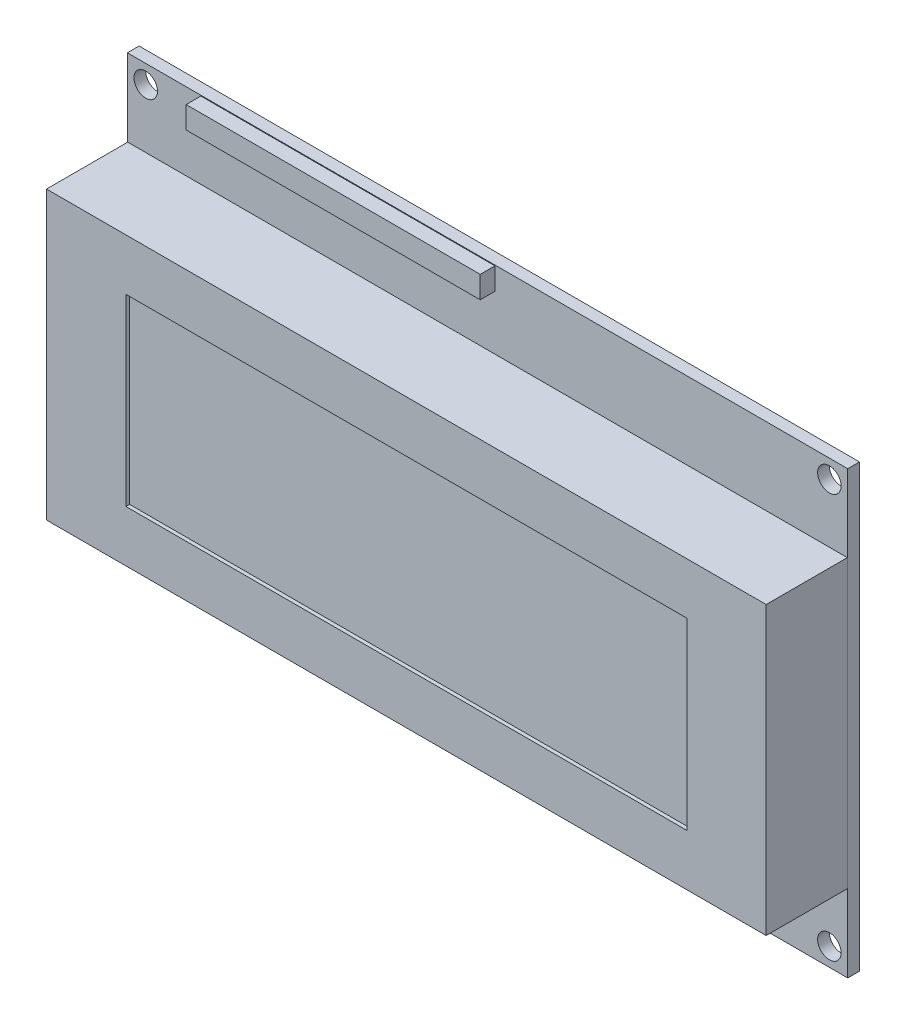
ISO-10303-21;
HEADER;
FILE_DESCRIPTION(('STEP AP214'),'2;1');
FILE_NAME('part.step','',(''),(''),'','','');
FILE_SCHEMA(('AUTOMOTIVE_DESIGN { 1 0 10303 214 1 1 1 1 }'));
ENDSEC;
DATA;
#1=APPLICATION_CONTEXT('core data for automotive mechanical design processes');
#2=APPLICATION_PROTOCOL_DEFINITION('international standard','automotive_design',2000,#1);
#3=PRODUCT_CONTEXT('',#1,'mechanical');
#4=PRODUCT('Part','Part','',(#3));
#5=PRODUCT_RELATED_PRODUCT_CATEGORY('part','',(#4));
#6=PRODUCT_DEFINITION_FORMATION('','',#4);
#7=PRODUCT_DEFINITION_CONTEXT('part definition',#1,'design');
#8=PRODUCT_DEFINITION('design','',#6,#7);
#9=PRODUCT_DEFINITION_SHAPE('','',#8);
#10=(LENGTH_UNIT() NAMED_UNIT(*) SI_UNIT(.MILLI.,.METRE.));
#11=(NAMED_UNIT(*) PLANE_ANGLE_UNIT() SI_UNIT($,.RADIAN.));
#12=(NAMED_UNIT(*) SI_UNIT($,.STERADIAN.) SOLID_ANGLE_UNIT());
#13=UNCERTAINTY_MEASURE_WITH_UNIT(LENGTH_MEASURE(1.E-05),#10,'distance_accuracy_value','');
#14=(GEOMETRIC_REPRESENTATION_CONTEXT(3) GLOBAL_UNCERTAINTY_ASSIGNED_CONTEXT((#13)) GLOBAL_UNIT_ASSIGNED_CONTEXT((#10,
#11,#12)) REPRESENTATION_CONTEXT('',''));
#15=CARTESIAN_POINT('',(0.,0.,0.));
#16=DIRECTION('',(0.,0.,1.));
#17=DIRECTION('',(1.,0.,0.));
#18=AXIS2_PLACEMENT_3D('',#15,#16,#17);
#19=CARTESIAN_POINT('',(0.,0.,1.6));
#20=DIRECTION('',(0.,0.,1.));
#21=DIRECTION('',(1.,0.,0.));
#22=AXIS2_PLACEMENT_3D('',#19,#20,#21);
#23=PLANE('',#22);
#24=CARTESIAN_POINT('',(46.5,27.5,1.6));
#25=DIRECTION('',(0.,0.,1.));
#26=DIRECTION('',(1.,0.,0.));
#27=AXIS2_PLACEMENT_3D('',#24,#25,#26);
#28=CIRCLE('',#27,1.6);
#29=CARTESIAN_POINT('',(48.1,27.5,1.6));
#30=VERTEX_POINT('',#29);
#31=EDGE_CURVE('E236',#30,#30,#28,.T.);
#32=ORIENTED_EDGE('',*,*,#31,.F.);
#33=EDGE_LOOP('',(#32));
#34=FACE_BOUND('',#33,.T.);
#35=CARTESIAN_POINT('',(46.5,-27.5,1.6));
#36=DIRECTION('',(0.,0.,1.));
#37=DIRECTION('',(1.,0.,0.));
#38=AXIS2_PLACEMENT_3D('',#35,#36,#37);
#39=CIRCLE('',#38,1.6);
#40=CARTESIAN_POINT('',(48.1,-27.5,1.6));
#41=VERTEX_POINT('',#40);
#42=EDGE_CURVE('E240',#41,#41,#39,.T.);
#43=ORIENTED_EDGE('',*,*,#42,.F.);
#44=EDGE_LOOP('',(#43));
#45=FACE_BOUND('',#44,.T.);
#46=CARTESIAN_POINT('',(-46.5,-27.5,1.6));
#47=DIRECTION('',(0.,0.,1.));
#48=DIRECTION('',(1.,0.,0.));
#49=AXIS2_PLACEMENT_3D('',#46,#47,#48);
#50=CIRCLE('',#49,1.6);
#51=CARTESIAN_POINT('',(-44.9,-27.5,1.6));
#52=VERTEX_POINT('',#51);
#53=EDGE_CURVE('E246',#52,#52,#50,.T.);
#54=ORIENTED_EDGE('',*,*,#53,.F.);
#55=EDGE_LOOP('',(#54));
#56=FACE_BOUND('',#55,.T.);
#57=CARTESIAN_POINT('',(-46.5,27.5,1.6));
#58=DIRECTION('',(0.,0.,1.));
#59=DIRECTION('',(1.,0.,0.));
#60=AXIS2_PLACEMENT_3D('',#57,#58,#59);
#61=CIRCLE('',#60,1.6);
#62=CARTESIAN_POINT('',(-44.9,27.5,1.6));
#63=VERTEX_POINT('',#62);
#64=EDGE_CURVE('E252',#63,#63,#61,.T.);
#65=ORIENTED_EDGE('',*,*,#64,.F.);
#66=EDGE_LOOP('',(#65));
#67=FACE_BOUND('',#66,.T.);
#68=DIRECTION('',(0.,1.,0.));
#69=VECTOR('',#68,1.);
#70=CARTESIAN_POINT('',(49.,30.,1.6));
#71=LINE('',#70,#69);
#72=CARTESIAN_POINT('',(49.,-30.,1.6));
#73=VERTEX_POINT('',#72);
#74=CARTESIAN_POINT('',(49.,30.,1.6));
#75=VERTEX_POINT('',#74);
#76=EDGE_CURVE('E261',#73,#75,#71,.T.);
#77=ORIENTED_EDGE('',*,*,#76,.T.);
#78=DIRECTION('',(-1.,0.,0.));
#79=VECTOR('',#78,1.);
#80=CARTESIAN_POINT('',(-49.,30.,1.6));
#81=LINE('',#80,#79);
#82=CARTESIAN_POINT('',(-49.,30.,1.6));
#83=VERTEX_POINT('',#82);
#84=EDGE_CURVE('E264',#75,#83,#81,.T.);
#85=ORIENTED_EDGE('',*,*,#84,.T.);
#86=DIRECTION('',(0.,-1.,0.));
#87=VECTOR('',#86,1.);
#88=CARTESIAN_POINT('',(-49.,30.,1.6));
#89=LINE('',#88,#87);
#90=CARTESIAN_POINT('',(-49.,-30.,1.6));
#91=VERTEX_POINT('',#90);
#92=EDGE_CURVE('E267',#83,#91,#89,.T.);
#93=ORIENTED_EDGE('',*,*,#92,.T.);
#94=DIRECTION('',(1.,0.,0.));
#95=VECTOR('',#94,1.);
#96=CARTESIAN_POINT('',(-49.,-30.,1.6));
#97=LINE('',#96,#95);
#98=EDGE_CURVE('E269',#91,#73,#97,.T.);
#99=ORIENTED_EDGE('',*,*,#98,.T.);
#100=EDGE_LOOP('',(#77,#85,#93,#99));
#101=FACE_BOUND('',#100,.T.);
#102=DIRECTION('',(-1.,0.,0.));
#103=VECTOR('',#102,1.);
#104=CARTESIAN_POINT('',(-48.95,19.5,1.6));
#105=LINE('',#104,#103);
#106=CARTESIAN_POINT('',(48.95,19.5,1.6));
#107=VERTEX_POINT('',#106);
#108=CARTESIAN_POINT('',(-48.95,19.5,1.6));
#109=VERTEX_POINT('',#108);
#110=EDGE_CURVE('E221',#107,#109,#105,.T.);
#111=ORIENTED_EDGE('',*,*,#110,.F.);
#112=DIRECTION('',(0.,1.,0.));
#113=VECTOR('',#112,1.);
#114=CARTESIAN_POINT('',(48.95,19.5,1.6));
#115=LINE('',#114,#113);
#116=CARTESIAN_POINT('',(48.95,-19.5,1.6));
#117=VERTEX_POINT('',#116);
#118=EDGE_CURVE('E202',#117,#107,#115,.T.);
#119=ORIENTED_EDGE('',*,*,#118,.F.);
#120=DIRECTION('',(1.,0.,0.));
#121=VECTOR('',#120,1.);
#122=CARTESIAN_POINT('',(-48.95,-19.5,1.6));
#123=LINE('',#122,#121);
#124=CARTESIAN_POINT('',(-48.95,-19.5,1.6));
#125=VERTEX_POINT('',#124);
#126=EDGE_CURVE('E212',#125,#117,#123,.T.);
#127=ORIENTED_EDGE('',*,*,#126,.F.);
#128=DIRECTION('',(0.,-1.,0.));
#129=VECTOR('',#128,1.);
#130=CARTESIAN_POINT('',(-48.95,19.5,1.6));
#131=LINE('',#130,#129);
#132=EDGE_CURVE('E223',#109,#125,#131,.T.);
#133=ORIENTED_EDGE('',*,*,#132,.F.);
#134=EDGE_LOOP('',(#111,#119,#127,#133));
#135=FACE_BOUND('',#134,.T.);
#136=DIRECTION('',(1.,0.,0.));
#137=VECTOR('',#136,1.);
#138=CARTESIAN_POINT('',(-39.,26.9,1.6));
#139=LINE('',#138,#137);
#140=CARTESIAN_POINT('',(-39.,26.9,1.6));
#141=VERTEX_POINT('',#140);
#142=CARTESIAN_POINT('',(1.,26.9,1.6));
#143=VERTEX_POINT('',#142);
#144=EDGE_CURVE('E544',#141,#143,#139,.T.);
#145=ORIENTED_EDGE('',*,*,#144,.F.);
#146=DIRECTION('',(0.,-1.,0.));
#147=VECTOR('',#146,1.);
#148=CARTESIAN_POINT('',(-39.,29.9,1.6));
#149=LINE('',#148,#147);
#150=CARTESIAN_POINT('',(-39.,29.9,1.6));
#151=VERTEX_POINT('',#150);
#152=EDGE_CURVE('E171',#151,#141,#149,.T.);
#153=ORIENTED_EDGE('',*,*,#152,.F.);
#154=DIRECTION('',(-1.,0.,0.));
#155=VECTOR('',#154,1.);
#156=CARTESIAN_POINT('',(-39.,29.9,1.6));
#157=LINE('',#156,#155);
#158=CARTESIAN_POINT('',(1.,29.9,1.6));
#159=VERTEX_POINT('',#158);
#160=EDGE_CURVE('E167',#159,#151,#157,.T.);
#161=ORIENTED_EDGE('',*,*,#160,.F.);
#162=DIRECTION('',(0.,1.,0.));
#163=VECTOR('',#162,1.);
#164=CARTESIAN_POINT('',(1.,29.9,1.6));
#165=LINE('',#164,#163);
#166=EDGE_CURVE('E541',#143,#159,#165,.T.);
#167=ORIENTED_EDGE('',*,*,#166,.F.);
#168=EDGE_LOOP('',(#145,#153,#161,#167));
#169=FACE_BOUND('',#168,.T.);
#170=ADVANCED_FACE('F35',(#34,#45,#56,#67,#101,#135,#169),#23,.T.);
#171=CARTESIAN_POINT('',(49.,30.,1.6));
#172=DIRECTION('',(-1.,0.,0.));
#173=DIRECTION('',(0.,0.,1.));
#174=AXIS2_PLACEMENT_3D('',#171,#172,#173);
#175=PLANE('',#174);
#176=DIRECTION('',(0.,1.,0.));
#177=VECTOR('',#176,1.);
#178=CARTESIAN_POINT('',(49.,30.,0.));
#179=LINE('',#178,#177);
#180=CARTESIAN_POINT('',(49.,-30.,0.));
#181=VERTEX_POINT('',#180);
#182=CARTESIAN_POINT('',(49.,30.,0.));
#183=VERTEX_POINT('',#182);
#184=EDGE_CURVE('E258',#181,#183,#179,.T.);
#185=ORIENTED_EDGE('',*,*,#184,.T.);
#186=DIRECTION('',(0.,0.,-1.));
#187=VECTOR('',#186,1.);
#188=CARTESIAN_POINT('',(49.,30.,1.6));
#189=LINE('',#188,#187);
#190=EDGE_CURVE('E11',#75,#183,#189,.T.);
#191=ORIENTED_EDGE('',*,*,#190,.F.);
#192=ORIENTED_EDGE('',*,*,#76,.F.);
#193=DIRECTION('',(0.,0.,-1.));
#194=VECTOR('',#193,1.);
#195=CARTESIAN_POINT('',(49.,-30.,1.6));
#196=LINE('',#195,#194);
#197=EDGE_CURVE('E271',#73,#181,#196,.T.);
#198=ORIENTED_EDGE('',*,*,#197,.T.);
#199=EDGE_LOOP('',(#185,#191,#192,#198));
#200=FACE_BOUND('',#199,.T.);
#201=ADVANCED_FACE('F37',(#200),#175,.F.);
#202=CARTESIAN_POINT('',(-49.,30.,1.6));
#203=DIRECTION('',(0.,-1.,0.));
#204=DIRECTION('',(0.,0.,-1.));
#205=AXIS2_PLACEMENT_3D('',#202,#203,#204);
#206=PLANE('',#205);
#207=DIRECTION('',(-1.,0.,0.));
#208=VECTOR('',#207,1.);
#209=CARTESIAN_POINT('',(-49.,30.,0.));
#210=LINE('',#209,#208);
#211=CARTESIAN_POINT('',(-49.,30.,0.));
#212=VERTEX_POINT('',#211);
#213=EDGE_CURVE('E274',#183,#212,#210,.T.);
#214=ORIENTED_EDGE('',*,*,#213,.T.);
#215=DIRECTION('',(0.,0.,-1.));
#216=VECTOR('',#215,1.);
#217=CARTESIAN_POINT('',(-49.,30.,1.6));
#218=LINE('',#217,#216);
#219=EDGE_CURVE('E43',#83,#212,#218,.T.);
#220=ORIENTED_EDGE('',*,*,#219,.F.);
#221=ORIENTED_EDGE('',*,*,#84,.F.);
#222=ORIENTED_EDGE('',*,*,#190,.T.);
#223=EDGE_LOOP('',(#214,#220,#221,#222));
#224=FACE_BOUND('',#223,.T.);
#225=ADVANCED_FACE('F304',(#224),#206,.F.);
#226=CARTESIAN_POINT('',(-49.,30.,1.6));
#227=DIRECTION('',(1.,0.,0.));
#228=DIRECTION('',(0.,1.,0.));
#229=AXIS2_PLACEMENT_3D('',#226,#227,#228);
#230=PLANE('',#229);
#231=DIRECTION('',(0.,-1.,0.));
#232=VECTOR('',#231,1.);
#233=CARTESIAN_POINT('',(-49.,30.,0.));
#234=LINE('',#233,#232);
#235=CARTESIAN_POINT('',(-49.,-30.,0.));
#236=VERTEX_POINT('',#235);
#237=EDGE_CURVE('E276',#212,#236,#234,.T.);
#238=ORIENTED_EDGE('',*,*,#237,.T.);
#239=DIRECTION('',(0.,0.,-1.));
#240=VECTOR('',#239,1.);
#241=CARTESIAN_POINT('',(-49.,-30.,1.6));
#242=LINE('',#241,#240);
#243=EDGE_CURVE('E281',#91,#236,#242,.T.);
#244=ORIENTED_EDGE('',*,*,#243,.F.);
#245=ORIENTED_EDGE('',*,*,#92,.F.);
#246=ORIENTED_EDGE('',*,*,#219,.T.);
#247=EDGE_LOOP('',(#238,#244,#245,#246));
#248=FACE_BOUND('',#247,.T.);
#249=ADVANCED_FACE('F288',(#248),#230,.F.);
#250=CARTESIAN_POINT('',(-49.,-30.,1.6));
#251=DIRECTION('',(0.,1.,0.));
#252=DIRECTION('',(0.,0.,1.));
#253=AXIS2_PLACEMENT_3D('',#250,#251,#252);
#254=PLANE('',#253);
#255=DIRECTION('',(1.,0.,0.));
#256=VECTOR('',#255,1.);
#257=CARTESIAN_POINT('',(-49.,-30.,0.));
#258=LINE('',#257,#256);
#259=EDGE_CURVE('E265',#236,#181,#258,.T.);
#260=ORIENTED_EDGE('',*,*,#259,.T.);
#261=ORIENTED_EDGE('',*,*,#197,.F.);
#262=ORIENTED_EDGE('',*,*,#98,.F.);
#263=ORIENTED_EDGE('',*,*,#243,.T.);
#264=EDGE_LOOP('',(#260,#261,#262,#263));
#265=FACE_BOUND('',#264,.T.);
#266=ADVANCED_FACE('F297',(#265),#254,.F.);
#267=CARTESIAN_POINT('',(0.,0.,0.));
#268=DIRECTION('',(0.,0.,1.));
#269=DIRECTION('',(1.,0.,0.));
#270=AXIS2_PLACEMENT_3D('',#267,#268,#269);
#271=PLANE('',#270);
#272=CARTESIAN_POINT('',(46.5,27.5,0.));
#273=DIRECTION('',(0.,0.,1.));
#274=DIRECTION('',(1.,0.,0.));
#275=AXIS2_PLACEMENT_3D('',#272,#273,#274);
#276=CIRCLE('',#275,1.6);
#277=CARTESIAN_POINT('',(48.1,27.5,0.));
#278=VERTEX_POINT('',#277);
#279=EDGE_CURVE('E237',#278,#278,#276,.T.);
#280=ORIENTED_EDGE('',*,*,#279,.T.);
#281=EDGE_LOOP('',(#280));
#282=FACE_BOUND('',#281,.T.);
#283=CARTESIAN_POINT('',(46.5,-27.5,0.));
#284=DIRECTION('',(0.,0.,1.));
#285=DIRECTION('',(1.,0.,0.));
#286=AXIS2_PLACEMENT_3D('',#283,#284,#285);
#287=CIRCLE('',#286,1.6);
#288=CARTESIAN_POINT('',(48.1,-27.5,0.));
#289=VERTEX_POINT('',#288);
#290=EDGE_CURVE('E243',#289,#289,#287,.T.);
#291=ORIENTED_EDGE('',*,*,#290,.T.);
#292=EDGE_LOOP('',(#291));
#293=FACE_BOUND('',#292,.T.);
#294=CARTESIAN_POINT('',(-46.5,-27.5,0.));
#295=DIRECTION('',(0.,0.,1.));
#296=DIRECTION('',(1.,0.,0.));
#297=AXIS2_PLACEMENT_3D('',#294,#295,#296);
#298=CIRCLE('',#297,1.6);
#299=CARTESIAN_POINT('',(-44.9,-27.5,0.));
#300=VERTEX_POINT('',#299);
#301=EDGE_CURVE('E249',#300,#300,#298,.T.);
#302=ORIENTED_EDGE('',*,*,#301,.T.);
#303=EDGE_LOOP('',(#302));
#304=FACE_BOUND('',#303,.T.);
#305=CARTESIAN_POINT('',(-46.5,27.5,0.));
#306=DIRECTION('',(0.,0.,1.));
#307=DIRECTION('',(1.,0.,0.));
#308=AXIS2_PLACEMENT_3D('',#305,#306,#307);
#309=CIRCLE('',#308,1.6);
#310=CARTESIAN_POINT('',(-44.9,27.5,0.));
#311=VERTEX_POINT('',#310);
#312=EDGE_CURVE('E255',#311,#311,#309,.T.);
#313=ORIENTED_EDGE('',*,*,#312,.T.);
#314=EDGE_LOOP('',(#313));
#315=FACE_BOUND('',#314,.T.);
#316=ORIENTED_EDGE('',*,*,#184,.F.);
#317=ORIENTED_EDGE('',*,*,#259,.F.);
#318=ORIENTED_EDGE('',*,*,#237,.F.);
#319=ORIENTED_EDGE('',*,*,#213,.F.);
#320=EDGE_LOOP('',(#316,#317,#318,#319));
#321=FACE_BOUND('',#320,.T.);
#322=ADVANCED_FACE('F294',(#282,#293,#304,#315,#321),#271,.F.);
#323=CARTESIAN_POINT('',(-46.5,27.5,0.));
#324=DIRECTION('',(0.,0.,1.));
#325=DIRECTION('',(1.,0.,0.));
#326=AXIS2_PLACEMENT_3D('',#323,#324,#325);
#327=CYLINDRICAL_SURFACE('',#326,1.6);
#328=ORIENTED_EDGE('',*,*,#312,.F.);
#329=EDGE_LOOP('',(#328));
#330=FACE_BOUND('',#329,.T.);
#331=ORIENTED_EDGE('',*,*,#64,.T.);
#332=EDGE_LOOP('',(#331));
#333=FACE_BOUND('',#332,.T.);
#334=ADVANCED_FACE('F320',(#330,#333),#327,.F.);
#335=CARTESIAN_POINT('',(-46.5,-27.5,0.));
#336=DIRECTION('',(0.,0.,1.));
#337=DIRECTION('',(1.,0.,0.));
#338=AXIS2_PLACEMENT_3D('',#335,#336,#337);
#339=CYLINDRICAL_SURFACE('',#338,1.6);
#340=ORIENTED_EDGE('',*,*,#301,.F.);
#341=EDGE_LOOP('',(#340));
#342=FACE_BOUND('',#341,.T.);
#343=ORIENTED_EDGE('',*,*,#53,.T.);
#344=EDGE_LOOP('',(#343));
#345=FACE_BOUND('',#344,.T.);
#346=ADVANCED_FACE('F340',(#342,#345),#339,.F.);
#347=CARTESIAN_POINT('',(46.5,-27.5,0.));
#348=DIRECTION('',(0.,0.,1.));
#349=DIRECTION('',(1.,0.,0.));
#350=AXIS2_PLACEMENT_3D('',#347,#348,#349);
#351=CYLINDRICAL_SURFACE('',#350,1.6);
#352=ORIENTED_EDGE('',*,*,#290,.F.);
#353=EDGE_LOOP('',(#352));
#354=FACE_BOUND('',#353,.T.);
#355=ORIENTED_EDGE('',*,*,#42,.T.);
#356=EDGE_LOOP('',(#355));
#357=FACE_BOUND('',#356,.T.);
#358=ADVANCED_FACE('F347',(#354,#357),#351,.F.);
#359=CARTESIAN_POINT('',(46.5,27.5,0.));
#360=DIRECTION('',(0.,0.,1.));
#361=DIRECTION('',(1.,0.,0.));
#362=AXIS2_PLACEMENT_3D('',#359,#360,#361);
#363=CYLINDRICAL_SURFACE('',#362,1.6);
#364=ORIENTED_EDGE('',*,*,#279,.F.);
#365=EDGE_LOOP('',(#364));
#366=FACE_BOUND('',#365,.T.);
#367=ORIENTED_EDGE('',*,*,#31,.T.);
#368=EDGE_LOOP('',(#367));
#369=FACE_BOUND('',#368,.T.);
#370=ADVANCED_FACE('F354',(#366,#369),#363,.F.);
#371=CARTESIAN_POINT('',(48.95,19.5,12.65));
#372=DIRECTION('',(-1.,0.,0.));
#373=DIRECTION('',(0.,0.,1.));
#374=AXIS2_PLACEMENT_3D('',#371,#372,#373);
#375=PLANE('',#374);
#376=ORIENTED_EDGE('',*,*,#118,.T.);
#377=DIRECTION('',(0.,0.,-1.));
#378=VECTOR('',#377,1.);
#379=CARTESIAN_POINT('',(48.95,19.5,12.65));
#380=LINE('',#379,#378);
#381=CARTESIAN_POINT('',(48.95,19.5,12.65));
#382=VERTEX_POINT('',#381);
#383=EDGE_CURVE('E234',#382,#107,#380,.T.);
#384=ORIENTED_EDGE('',*,*,#383,.F.);
#385=DIRECTION('',(0.,1.,0.));
#386=VECTOR('',#385,1.);
#387=CARTESIAN_POINT('',(48.95,19.5,12.65));
#388=LINE('',#387,#386);
#389=CARTESIAN_POINT('',(48.95,-19.5,12.65));
#390=VERTEX_POINT('',#389);
#391=EDGE_CURVE('E208',#390,#382,#388,.T.);
#392=ORIENTED_EDGE('',*,*,#391,.F.);
#393=DIRECTION('',(0.,0.,-1.));
#394=VECTOR('',#393,1.);
#395=CARTESIAN_POINT('',(48.95,-19.5,12.65));
#396=LINE('',#395,#394);
#397=EDGE_CURVE('E218',#390,#117,#396,.T.);
#398=ORIENTED_EDGE('',*,*,#397,.T.);
#399=EDGE_LOOP('',(#376,#384,#392,#398));
#400=FACE_BOUND('',#399,.T.);
#401=ADVANCED_FACE('F362',(#400),#375,.F.);
#402=CARTESIAN_POINT('',(-48.95,19.5,12.65));
#403=DIRECTION('',(0.,-1.,0.));
#404=DIRECTION('',(0.,0.,-1.));
#405=AXIS2_PLACEMENT_3D('',#402,#403,#404);
#406=PLANE('',#405);
#407=ORIENTED_EDGE('',*,*,#110,.T.);
#408=DIRECTION('',(0.,0.,-1.));
#409=VECTOR('',#408,1.);
#410=CARTESIAN_POINT('',(-48.95,19.5,12.65));
#411=LINE('',#410,#409);
#412=CARTESIAN_POINT('',(-48.95,19.5,12.65));
#413=VERTEX_POINT('',#412);
#414=EDGE_CURVE('E231',#413,#109,#411,.T.);
#415=ORIENTED_EDGE('',*,*,#414,.F.);
#416=DIRECTION('',(-1.,0.,0.));
#417=VECTOR('',#416,1.);
#418=CARTESIAN_POINT('',(-48.95,19.5,12.65));
#419=LINE('',#418,#417);
#420=EDGE_CURVE('E211',#382,#413,#419,.T.);
#421=ORIENTED_EDGE('',*,*,#420,.F.);
#422=ORIENTED_EDGE('',*,*,#383,.T.);
#423=EDGE_LOOP('',(#407,#415,#421,#422));
#424=FACE_BOUND('',#423,.T.);
#425=ADVANCED_FACE('F370',(#424),#406,.F.);
#426=CARTESIAN_POINT('',(-48.95,19.5,12.65));
#427=DIRECTION('',(1.,0.,0.));
#428=DIRECTION('',(0.,0.,-1.));
#429=AXIS2_PLACEMENT_3D('',#426,#427,#428);
#430=PLANE('',#429);
#431=ORIENTED_EDGE('',*,*,#132,.T.);
#432=DIRECTION('',(0.,0.,-1.));
#433=VECTOR('',#432,1.);
#434=CARTESIAN_POINT('',(-48.95,-19.5,12.65));
#435=LINE('',#434,#433);
#436=CARTESIAN_POINT('',(-48.95,-19.5,12.65));
#437=VERTEX_POINT('',#436);
#438=EDGE_CURVE('E229',#437,#125,#435,.T.);
#439=ORIENTED_EDGE('',*,*,#438,.F.);
#440=DIRECTION('',(0.,-1.,0.));
#441=VECTOR('',#440,1.);
#442=CARTESIAN_POINT('',(-48.95,19.5,12.65));
#443=LINE('',#442,#441);
#444=EDGE_CURVE('E214',#413,#437,#443,.T.);
#445=ORIENTED_EDGE('',*,*,#444,.F.);
#446=ORIENTED_EDGE('',*,*,#414,.T.);
#447=EDGE_LOOP('',(#431,#439,#445,#446));
#448=FACE_BOUND('',#447,.T.);
#449=ADVANCED_FACE('F378',(#448),#430,.F.);
#450=CARTESIAN_POINT('',(-48.95,-19.5,12.65));
#451=DIRECTION('',(0.,1.,0.));
#452=DIRECTION('',(0.,0.,1.));
#453=AXIS2_PLACEMENT_3D('',#450,#451,#452);
#454=PLANE('',#453);
#455=ORIENTED_EDGE('',*,*,#126,.T.);
#456=ORIENTED_EDGE('',*,*,#397,.F.);
#457=DIRECTION('',(1.,0.,0.));
#458=VECTOR('',#457,1.);
#459=CARTESIAN_POINT('',(-48.95,-19.5,12.65));
#460=LINE('',#459,#458);
#461=EDGE_CURVE('E216',#437,#390,#460,.T.);
#462=ORIENTED_EDGE('',*,*,#461,.F.);
#463=ORIENTED_EDGE('',*,*,#438,.T.);
#464=EDGE_LOOP('',(#455,#456,#462,#463));
#465=FACE_BOUND('',#464,.T.);
#466=ADVANCED_FACE('F386',(#465),#454,.F.);
#467=CARTESIAN_POINT('',(0.,0.,12.65));
#468=DIRECTION('',(0.,0.,1.));
#469=DIRECTION('',(1.,0.,0.));
#470=AXIS2_PLACEMENT_3D('',#467,#468,#469);
#471=PLANE('',#470);
#472=DIRECTION('',(0.,1.,0.));
#473=VECTOR('',#472,1.);
#474=CARTESIAN_POINT('',(38.15,12.5,12.65));
#475=LINE('',#474,#473);
#476=CARTESIAN_POINT('',(38.15,-12.5,12.65));
#477=VERTEX_POINT('',#476);
#478=CARTESIAN_POINT('',(38.15,12.5,12.65));
#479=VERTEX_POINT('',#478);
#480=EDGE_CURVE('E58',#477,#479,#475,.T.);
#481=ORIENTED_EDGE('',*,*,#480,.F.);
#482=DIRECTION('',(1.,0.,0.));
#483=VECTOR('',#482,1.);
#484=CARTESIAN_POINT('',(-38.15,-12.5,12.65));
#485=LINE('',#484,#483);
#486=CARTESIAN_POINT('',(-38.15,-12.5,12.65));
#487=VERTEX_POINT('',#486);
#488=EDGE_CURVE('E183',#487,#477,#485,.T.);
#489=ORIENTED_EDGE('',*,*,#488,.F.);
#490=DIRECTION('',(0.,-1.,0.));
#491=VECTOR('',#490,1.);
#492=CARTESIAN_POINT('',(-38.15,12.5,12.65));
#493=LINE('',#492,#491);
#494=CARTESIAN_POINT('',(-38.15,12.5,12.65));
#495=VERTEX_POINT('',#494);
#496=EDGE_CURVE('E195',#495,#487,#493,.T.);
#497=ORIENTED_EDGE('',*,*,#496,.F.);
#498=DIRECTION('',(-1.,0.,0.));
#499=VECTOR('',#498,1.);
#500=CARTESIAN_POINT('',(-38.15,12.5,12.65));
#501=LINE('',#500,#499);
#502=EDGE_CURVE('E174',#479,#495,#501,.T.);
#503=ORIENTED_EDGE('',*,*,#502,.F.);
#504=EDGE_LOOP('',(#481,#489,#497,#503));
#505=FACE_BOUND('',#504,.T.);
#506=ORIENTED_EDGE('',*,*,#391,.T.);
#507=ORIENTED_EDGE('',*,*,#420,.T.);
#508=ORIENTED_EDGE('',*,*,#444,.T.);
#509=ORIENTED_EDGE('',*,*,#461,.T.);
#510=EDGE_LOOP('',(#506,#507,#508,#509));
#511=FACE_BOUND('',#510,.T.);
#512=ADVANCED_FACE('F394',(#505,#511),#471,.T.);
#513=CARTESIAN_POINT('',(38.15,12.5,12.15));
#514=DIRECTION('',(1.,0.,0.));
#515=DIRECTION('',(0.,0.,-1.));
#516=AXIS2_PLACEMENT_3D('',#513,#514,#515);
#517=PLANE('',#516);
#518=ORIENTED_EDGE('',*,*,#480,.T.);
#519=DIRECTION('',(0.,0.,1.));
#520=VECTOR('',#519,1.);
#521=CARTESIAN_POINT('',(38.15,12.5,12.15));
#522=LINE('',#521,#520);
#523=CARTESIAN_POINT('',(38.15,12.5,12.15));
#524=VERTEX_POINT('',#523);
#525=EDGE_CURVE('E191',#524,#479,#522,.T.);
#526=ORIENTED_EDGE('',*,*,#525,.F.);
#527=DIRECTION('',(0.,1.,0.));
#528=VECTOR('',#527,1.);
#529=CARTESIAN_POINT('',(38.15,12.5,12.15));
#530=LINE('',#529,#528);
#531=CARTESIAN_POINT('',(38.15,-12.5,12.15));
#532=VERTEX_POINT('',#531);
#533=EDGE_CURVE('E179',#532,#524,#530,.T.);
#534=ORIENTED_EDGE('',*,*,#533,.F.);
#535=DIRECTION('',(0.,0.,1.));
#536=VECTOR('',#535,1.);
#537=CARTESIAN_POINT('',(38.15,-12.5,12.15));
#538=LINE('',#537,#536);
#539=EDGE_CURVE('E200',#532,#477,#538,.T.);
#540=ORIENTED_EDGE('',*,*,#539,.T.);
#541=EDGE_LOOP('',(#518,#526,#534,#540));
#542=FACE_BOUND('',#541,.T.);
#543=ADVANCED_FACE('F402',(#542),#517,.F.);
#544=CARTESIAN_POINT('',(-38.15,-12.5,12.15));
#545=DIRECTION('',(0.,-1.,0.));
#546=DIRECTION('',(0.,0.,-1.));
#547=AXIS2_PLACEMENT_3D('',#544,#545,#546);
#548=PLANE('',#547);
#549=ORIENTED_EDGE('',*,*,#488,.T.);
#550=ORIENTED_EDGE('',*,*,#539,.F.);
#551=DIRECTION('',(1.,0.,0.));
#552=VECTOR('',#551,1.);
#553=CARTESIAN_POINT('',(-38.15,-12.5,12.15));
#554=LINE('',#553,#552);
#555=CARTESIAN_POINT('',(-38.15,-12.5,12.15));
#556=VERTEX_POINT('',#555);
#557=EDGE_CURVE('E189',#556,#532,#554,.T.);
#558=ORIENTED_EDGE('',*,*,#557,.F.);
#559=DIRECTION('',(0.,0.,1.));
#560=VECTOR('',#559,1.);
#561=CARTESIAN_POINT('',(-38.15,-12.5,12.15));
#562=LINE('',#561,#560);
#563=EDGE_CURVE('E203',#556,#487,#562,.T.);
#564=ORIENTED_EDGE('',*,*,#563,.T.);
#565=EDGE_LOOP('',(#549,#550,#558,#564));
#566=FACE_BOUND('',#565,.T.);
#567=ADVANCED_FACE('F410',(#566),#548,.F.);
#568=CARTESIAN_POINT('',(-38.15,12.5,12.15));
#569=DIRECTION('',(-1.,0.,0.));
#570=DIRECTION('',(0.,-1.,0.));
#571=AXIS2_PLACEMENT_3D('',#568,#569,#570);
#572=PLANE('',#571);
#573=ORIENTED_EDGE('',*,*,#496,.T.);
#574=ORIENTED_EDGE('',*,*,#563,.F.);
#575=DIRECTION('',(0.,-1.,0.));
#576=VECTOR('',#575,1.);
#577=CARTESIAN_POINT('',(-38.15,12.5,12.15));
#578=LINE('',#577,#576);
#579=CARTESIAN_POINT('',(-38.15,12.5,12.15));
#580=VERTEX_POINT('',#579);
#581=EDGE_CURVE('E186',#580,#556,#578,.T.);
#582=ORIENTED_EDGE('',*,*,#581,.F.);
#583=DIRECTION('',(0.,0.,1.));
#584=VECTOR('',#583,1.);
#585=CARTESIAN_POINT('',(-38.15,12.5,12.15));
#586=LINE('',#585,#584);
#587=EDGE_CURVE('E205',#580,#495,#586,.T.);
#588=ORIENTED_EDGE('',*,*,#587,.T.);
#589=EDGE_LOOP('',(#573,#574,#582,#588));
#590=FACE_BOUND('',#589,.T.);
#591=ADVANCED_FACE('F417',(#590),#572,.F.);
#592=CARTESIAN_POINT('',(-38.15,12.5,12.15));
#593=DIRECTION('',(0.,1.,0.));
#594=DIRECTION('',(-1.,0.,0.));
#595=AXIS2_PLACEMENT_3D('',#592,#593,#594);
#596=PLANE('',#595);
#597=ORIENTED_EDGE('',*,*,#502,.T.);
#598=ORIENTED_EDGE('',*,*,#587,.F.);
#599=DIRECTION('',(-1.,0.,0.));
#600=VECTOR('',#599,1.);
#601=CARTESIAN_POINT('',(-38.15,12.5,12.15));
#602=LINE('',#601,#600);
#603=EDGE_CURVE('E182',#524,#580,#602,.T.);
#604=ORIENTED_EDGE('',*,*,#603,.F.);
#605=ORIENTED_EDGE('',*,*,#525,.T.);
#606=EDGE_LOOP('',(#597,#598,#604,#605));
#607=FACE_BOUND('',#606,.T.);
#608=ADVANCED_FACE('F425',(#607),#596,.F.);
#609=CARTESIAN_POINT('',(0.,0.,12.15));
#610=DIRECTION('',(0.,0.,1.));
#611=DIRECTION('',(1.,0.,0.));
#612=AXIS2_PLACEMENT_3D('',#609,#610,#611);
#613=PLANE('',#612);
#614=ORIENTED_EDGE('',*,*,#533,.T.);
#615=ORIENTED_EDGE('',*,*,#603,.T.);
#616=ORIENTED_EDGE('',*,*,#581,.T.);
#617=ORIENTED_EDGE('',*,*,#557,.T.);
#618=EDGE_LOOP('',(#614,#615,#616,#617));
#619=FACE_BOUND('',#618,.T.);
#620=ADVANCED_FACE('F433',(#619),#613,.T.);
#621=CARTESIAN_POINT('',(-39.,29.9,3.6));
#622=DIRECTION('',(1.,0.,0.));
#623=DIRECTION('',(0.,1.,0.));
#624=AXIS2_PLACEMENT_3D('',#621,#622,#623);
#625=PLANE('',#624);
#626=ORIENTED_EDGE('',*,*,#152,.T.);
#627=DIRECTION('',(0.,0.,-1.));
#628=VECTOR('',#627,1.);
#629=CARTESIAN_POINT('',(-39.,26.9,3.6));
#630=LINE('',#629,#628);
#631=CARTESIAN_POINT('',(-39.,26.9,3.6));
#632=VERTEX_POINT('',#631);
#633=EDGE_CURVE('E152',#632,#141,#630,.T.);
#634=ORIENTED_EDGE('',*,*,#633,.F.);
#635=DIRECTION('',(0.,-1.,0.));
#636=VECTOR('',#635,1.);
#637=CARTESIAN_POINT('',(-39.,29.9,3.6));
#638=LINE('',#637,#636);
#639=CARTESIAN_POINT('',(-39.,29.9,3.6));
#640=VERTEX_POINT('',#639);
#641=EDGE_CURVE('E159',#640,#632,#638,.T.);
#642=ORIENTED_EDGE('',*,*,#641,.F.);
#643=DIRECTION('',(0.,0.,-1.));
#644=VECTOR('',#643,1.);
#645=CARTESIAN_POINT('',(-39.,29.9,3.6));
#646=LINE('',#645,#644);
#647=EDGE_CURVE('E538',#640,#151,#646,.T.);
#648=ORIENTED_EDGE('',*,*,#647,.T.);
#649=EDGE_LOOP('',(#626,#634,#642,#648));
#650=FACE_BOUND('',#649,.T.);
#651=ADVANCED_FACE('F169',(#650),#625,.F.);
#652=CARTESIAN_POINT('',(-39.,26.9,3.6));
#653=DIRECTION('',(0.,1.,0.));
#654=DIRECTION('',(0.,0.,1.));
#655=AXIS2_PLACEMENT_3D('',#652,#653,#654);
#656=PLANE('',#655);
#657=ORIENTED_EDGE('',*,*,#144,.T.);
#658=DIRECTION('',(0.,0.,-1.));
#659=VECTOR('',#658,1.);
#660=CARTESIAN_POINT('',(1.,26.9,3.6));
#661=LINE('',#660,#659);
#662=CARTESIAN_POINT('',(1.,26.9,3.6));
#663=VERTEX_POINT('',#662);
#664=EDGE_CURVE('E155',#663,#143,#661,.T.);
#665=ORIENTED_EDGE('',*,*,#664,.F.);
#666=DIRECTION('',(1.,0.,0.));
#667=VECTOR('',#666,1.);
#668=CARTESIAN_POINT('',(-39.,26.9,3.6));
#669=LINE('',#668,#667);
#670=EDGE_CURVE('E148',#632,#663,#669,.T.);
#671=ORIENTED_EDGE('',*,*,#670,.F.);
#672=ORIENTED_EDGE('',*,*,#633,.T.);
#673=EDGE_LOOP('',(#657,#665,#671,#672));
#674=FACE_BOUND('',#673,.T.);
#675=ADVANCED_FACE('F150',(#674),#656,.F.);
#676=CARTESIAN_POINT('',(1.,29.9,3.6));
#677=DIRECTION('',(-1.,0.,0.));
#678=DIRECTION('',(0.,0.,1.));
#679=AXIS2_PLACEMENT_3D('',#676,#677,#678);
#680=PLANE('',#679);
#681=ORIENTED_EDGE('',*,*,#166,.T.);
#682=DIRECTION('',(0.,0.,-1.));
#683=VECTOR('',#682,1.);
#684=CARTESIAN_POINT('',(1.,29.9,3.6));
#685=LINE('',#684,#683);
#686=CARTESIAN_POINT('',(1.,29.9,3.6));
#687=VERTEX_POINT('',#686);
#688=EDGE_CURVE('E50',#687,#159,#685,.T.);
#689=ORIENTED_EDGE('',*,*,#688,.F.);
#690=DIRECTION('',(0.,1.,0.));
#691=VECTOR('',#690,1.);
#692=CARTESIAN_POINT('',(1.,29.9,3.6));
#693=LINE('',#692,#691);
#694=EDGE_CURVE('E158',#663,#687,#693,.T.);
#695=ORIENTED_EDGE('',*,*,#694,.F.);
#696=ORIENTED_EDGE('',*,*,#664,.T.);
#697=EDGE_LOOP('',(#681,#689,#695,#696));
#698=FACE_BOUND('',#697,.T.);
#699=ADVANCED_FACE('F454',(#698),#680,.F.);
#700=CARTESIAN_POINT('',(-39.,29.9,3.6));
#701=DIRECTION('',(0.,-1.,0.));
#702=DIRECTION('',(1.,0.,0.));
#703=AXIS2_PLACEMENT_3D('',#700,#701,#702);
#704=PLANE('',#703);
#705=ORIENTED_EDGE('',*,*,#160,.T.);
#706=ORIENTED_EDGE('',*,*,#647,.F.);
#707=DIRECTION('',(-1.,0.,0.));
#708=VECTOR('',#707,1.);
#709=CARTESIAN_POINT('',(-39.,29.9,3.6));
#710=LINE('',#709,#708);
#711=EDGE_CURVE('E163',#687,#640,#710,.T.);
#712=ORIENTED_EDGE('',*,*,#711,.F.);
#713=ORIENTED_EDGE('',*,*,#688,.T.);
#714=EDGE_LOOP('',(#705,#706,#712,#713));
#715=FACE_BOUND('',#714,.T.);
#716=ADVANCED_FACE('F461',(#715),#704,.F.);
#717=CARTESIAN_POINT('',(0.,0.,3.6));
#718=DIRECTION('',(0.,0.,1.));
#719=DIRECTION('',(1.,0.,0.));
#720=AXIS2_PLACEMENT_3D('',#717,#718,#719);
#721=PLANE('',#720);
#722=ORIENTED_EDGE('',*,*,#641,.T.);
#723=ORIENTED_EDGE('',*,*,#670,.T.);
#724=ORIENTED_EDGE('',*,*,#694,.T.);
#725=ORIENTED_EDGE('',*,*,#711,.T.);
#726=EDGE_LOOP('',(#722,#723,#724,#725));
#727=FACE_BOUND('',#726,.T.);
#728=ADVANCED_FACE('F162',(#727),#721,.T.);
#729=CLOSED_SHELL('',(#170,#201,#225,#249,#266,#322,#334,#346,#358,#370,#401,#425,#449,#466,
#512,#543,#567,#591,#608,#620,#651,#675,#699,#716,#728));
#730=MANIFOLD_SOLID_BREP('B2',#729);
#731=ADVANCED_BREP_SHAPE_REPRESENTATION('',(#18,#730),#14);
#732=SHAPE_DEFINITION_REPRESENTATION(#9,#731);
ENDSEC;
END-ISO-10303-21;
